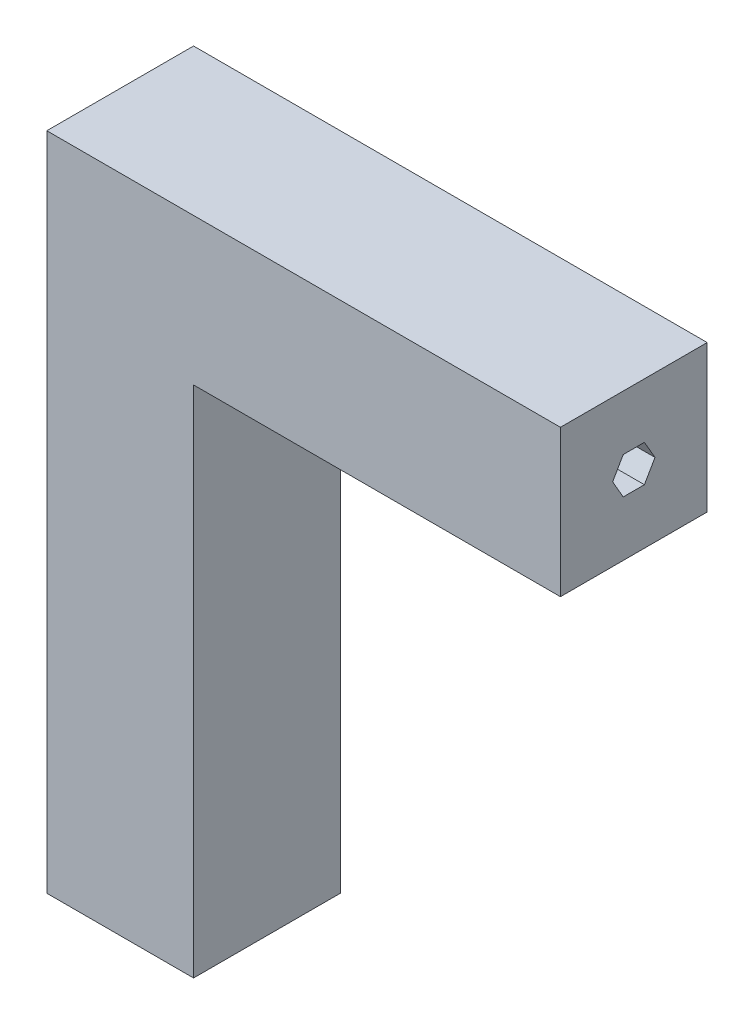
ISO-10303-21;
HEADER;
FILE_DESCRIPTION(('STEP AP214'),'2;1');
FILE_NAME('part.step','',(''),(''),'','','');
FILE_SCHEMA(('AUTOMOTIVE_DESIGN { 1 0 10303 214 1 1 1 1 }'));
ENDSEC;
DATA;
#1=APPLICATION_CONTEXT('core data for automotive mechanical design processes');
#2=APPLICATION_PROTOCOL_DEFINITION('international standard','automotive_design',2000,#1);
#3=PRODUCT_CONTEXT('',#1,'mechanical');
#4=PRODUCT('Part','Part','',(#3));
#5=PRODUCT_RELATED_PRODUCT_CATEGORY('part','',(#4));
#6=PRODUCT_DEFINITION_FORMATION('','',#4);
#7=PRODUCT_DEFINITION_CONTEXT('part definition',#1,'design');
#8=PRODUCT_DEFINITION('design','',#6,#7);
#9=PRODUCT_DEFINITION_SHAPE('','',#8);
#10=(LENGTH_UNIT() NAMED_UNIT(*) SI_UNIT(.MILLI.,.METRE.));
#11=(NAMED_UNIT(*) PLANE_ANGLE_UNIT() SI_UNIT($,.RADIAN.));
#12=(NAMED_UNIT(*) SI_UNIT($,.STERADIAN.) SOLID_ANGLE_UNIT());
#13=UNCERTAINTY_MEASURE_WITH_UNIT(LENGTH_MEASURE(1.E-05),#10,'distance_accuracy_value','');
#14=(GEOMETRIC_REPRESENTATION_CONTEXT(3) GLOBAL_UNCERTAINTY_ASSIGNED_CONTEXT((#13)) GLOBAL_UNIT_ASSIGNED_CONTEXT((#10,
#11,#12)) REPRESENTATION_CONTEXT('',''));
#15=CARTESIAN_POINT('',(0.,0.,0.));
#16=DIRECTION('',(0.,0.,1.));
#17=DIRECTION('',(1.,0.,0.));
#18=AXIS2_PLACEMENT_3D('',#15,#16,#17);
#19=CARTESIAN_POINT('',(0.,0.,-25.4));
#20=DIRECTION('',(-1.,0.,0.));
#21=DIRECTION('',(0.,0.,1.));
#22=AXIS2_PLACEMENT_3D('',#19,#20,#21);
#23=PLANE('',#22);
#24=DIRECTION('',(0.,-1.,0.));
#25=VECTOR('',#24,1.);
#26=CARTESIAN_POINT('',(0.,0.,25.4));
#27=LINE('',#26,#25);
#28=CARTESIAN_POINT('',(0.,228.6,25.4));
#29=VERTEX_POINT('',#28);
#30=CARTESIAN_POINT('',(0.,0.,25.4));
#31=VERTEX_POINT('',#30);
#32=EDGE_CURVE('E141',#29,#31,#27,.T.);
#33=ORIENTED_EDGE('',*,*,#32,.F.);
#34=DIRECTION('',(0.,0.,1.));
#35=VECTOR('',#34,1.);
#36=CARTESIAN_POINT('',(0.,228.6,-25.4));
#37=LINE('',#36,#35);
#38=CARTESIAN_POINT('',(0.,228.6,-25.4));
#39=VERTEX_POINT('',#38);
#40=EDGE_CURVE('E11',#39,#29,#37,.T.);
#41=ORIENTED_EDGE('',*,*,#40,.F.);
#42=DIRECTION('',(0.,-1.,0.));
#43=VECTOR('',#42,1.);
#44=CARTESIAN_POINT('',(0.,0.,-25.4));
#45=LINE('',#44,#43);
#46=CARTESIAN_POINT('',(0.,0.,-25.4));
#47=VERTEX_POINT('',#46);
#48=EDGE_CURVE('E162',#39,#47,#45,.T.);
#49=ORIENTED_EDGE('',*,*,#48,.T.);
#50=DIRECTION('',(0.,0.,1.));
#51=VECTOR('',#50,1.);
#52=CARTESIAN_POINT('',(0.,0.,-25.4));
#53=LINE('',#52,#51);
#54=EDGE_CURVE('E42',#47,#31,#53,.T.);
#55=ORIENTED_EDGE('',*,*,#54,.T.);
#56=EDGE_LOOP('',(#33,#41,#49,#55));
#57=FACE_BOUND('',#56,.T.);
#58=ADVANCED_FACE('F39',(#57),#23,.T.);
#59=CARTESIAN_POINT('',(0.,228.6,-25.4));
#60=DIRECTION('',(0.,1.,0.));
#61=DIRECTION('',(0.,0.,1.));
#62=AXIS2_PLACEMENT_3D('',#59,#60,#61);
#63=PLANE('',#62);
#64=DIRECTION('',(-1.,0.,0.));
#65=VECTOR('',#64,1.);
#66=CARTESIAN_POINT('',(0.,228.6,25.4));
#67=LINE('',#66,#65);
#68=CARTESIAN_POINT('',(177.8,228.6,25.4));
#69=VERTEX_POINT('',#68);
#70=EDGE_CURVE('E159',#69,#29,#67,.T.);
#71=ORIENTED_EDGE('',*,*,#70,.F.);
#72=DIRECTION('',(0.,0.,1.));
#73=VECTOR('',#72,1.);
#74=CARTESIAN_POINT('',(177.8,228.6,-25.4));
#75=LINE('',#74,#73);
#76=CARTESIAN_POINT('',(177.8,228.6,-25.4));
#77=VERTEX_POINT('',#76);
#78=EDGE_CURVE('E48',#77,#69,#75,.T.);
#79=ORIENTED_EDGE('',*,*,#78,.F.);
#80=DIRECTION('',(-1.,0.,0.));
#81=VECTOR('',#80,1.);
#82=CARTESIAN_POINT('',(50.8,228.6,-25.4));
#83=LINE('',#82,#81);
#84=EDGE_CURVE('E64',#77,#39,#83,.T.);
#85=ORIENTED_EDGE('',*,*,#84,.T.);
#86=ORIENTED_EDGE('',*,*,#40,.T.);
#87=EDGE_LOOP('',(#71,#79,#85,#86));
#88=FACE_BOUND('',#87,.T.);
#89=ADVANCED_FACE('F176',(#88),#63,.T.);
#90=CARTESIAN_POINT('',(177.8,228.6,-25.4));
#91=DIRECTION('',(1.,0.,0.));
#92=DIRECTION('',(0.,0.,-1.));
#93=AXIS2_PLACEMENT_3D('',#90,#91,#92);
#94=PLANE('',#93);
#95=DIRECTION('',(0.,0.866025403784439,-0.5));
#96=VECTOR('',#95,1.);
#97=CARTESIAN_POINT('',(177.8,196.85,-3.6661742093541));
#98=LINE('',#97,#96);
#99=CARTESIAN_POINT('',(177.8,196.85,-3.6661742093541));
#100=VERTEX_POINT('',#99);
#101=CARTESIAN_POINT('',(177.8,203.2,-7.33234841870826));
#102=VERTEX_POINT('',#101);
#103=EDGE_CURVE('E56',#100,#102,#98,.T.);
#104=ORIENTED_EDGE('',*,*,#103,.F.);
#105=DIRECTION('',(0.,0.,-1.));
#106=VECTOR('',#105,1.);
#107=CARTESIAN_POINT('',(177.8,196.85,3.66617420935411));
#108=LINE('',#107,#106);
#109=CARTESIAN_POINT('',(177.8,196.85,3.66617420935411));
#110=VERTEX_POINT('',#109);
#111=EDGE_CURVE('E244',#110,#100,#108,.T.);
#112=ORIENTED_EDGE('',*,*,#111,.F.);
#113=DIRECTION('',(0.,-0.866025403784438,-0.5));
#114=VECTOR('',#113,1.);
#115=CARTESIAN_POINT('',(177.8,203.2,7.33234841870825));
#116=LINE('',#115,#114);
#117=CARTESIAN_POINT('',(177.8,203.2,7.33234841870825));
#118=VERTEX_POINT('',#117);
#119=EDGE_CURVE('E251',#118,#110,#116,.T.);
#120=ORIENTED_EDGE('',*,*,#119,.F.);
#121=DIRECTION('',(0.,-0.866025403784439,0.5));
#122=VECTOR('',#121,1.);
#123=CARTESIAN_POINT('',(177.8,209.55,3.66617420935415));
#124=LINE('',#123,#122);
#125=CARTESIAN_POINT('',(177.8,209.55,3.66617420935415));
#126=VERTEX_POINT('',#125);
#127=EDGE_CURVE('E276',#126,#118,#124,.T.);
#128=ORIENTED_EDGE('',*,*,#127,.F.);
#129=DIRECTION('',(0.,0.,1.));
#130=VECTOR('',#129,1.);
#131=CARTESIAN_POINT('',(177.8,209.55,-3.66617420935417));
#132=LINE('',#131,#130);
#133=CARTESIAN_POINT('',(177.8,209.55,-3.66617420935417));
#134=VERTEX_POINT('',#133);
#135=EDGE_CURVE('E272',#134,#126,#132,.T.);
#136=ORIENTED_EDGE('',*,*,#135,.F.);
#137=DIRECTION('',(0.,0.866025403784439,0.5));
#138=VECTOR('',#137,1.);
#139=CARTESIAN_POINT('',(177.8,203.2,-7.33234841870825));
#140=LINE('',#139,#138);
#141=EDGE_CURVE('E268',#102,#134,#140,.T.);
#142=ORIENTED_EDGE('',*,*,#141,.F.);
#143=EDGE_LOOP('',(#104,#112,#120,#128,#136,#142));
#144=FACE_BOUND('',#143,.T.);
#145=DIRECTION('',(0.,1.,0.));
#146=VECTOR('',#145,1.);
#147=CARTESIAN_POINT('',(177.8,228.6,25.4));
#148=LINE('',#147,#146);
#149=CARTESIAN_POINT('',(177.8,177.8,25.4));
#150=VERTEX_POINT('',#149);
#151=EDGE_CURVE('E113',#150,#69,#148,.T.);
#152=ORIENTED_EDGE('',*,*,#151,.F.);
#153=DIRECTION('',(0.,0.,1.));
#154=VECTOR('',#153,1.);
#155=CARTESIAN_POINT('',(177.8,177.8,-25.4));
#156=LINE('',#155,#154);
#157=CARTESIAN_POINT('',(177.8,177.8,-25.4));
#158=VERTEX_POINT('',#157);
#159=EDGE_CURVE('E107',#158,#150,#156,.T.);
#160=ORIENTED_EDGE('',*,*,#159,.F.);
#161=DIRECTION('',(0.,1.,0.));
#162=VECTOR('',#161,1.);
#163=CARTESIAN_POINT('',(177.8,228.6,-25.4));
#164=LINE('',#163,#162);
#165=EDGE_CURVE('E111',#158,#77,#164,.T.);
#166=ORIENTED_EDGE('',*,*,#165,.T.);
#167=ORIENTED_EDGE('',*,*,#78,.T.);
#168=EDGE_LOOP('',(#152,#160,#166,#167));
#169=FACE_BOUND('',#168,.T.);
#170=ADVANCED_FACE('F109',(#144,#169),#94,.T.);
#171=CARTESIAN_POINT('',(50.8,177.8,-25.4));
#172=DIRECTION('',(0.,-1.,0.));
#173=DIRECTION('',(0.,0.,-1.));
#174=AXIS2_PLACEMENT_3D('',#171,#172,#173);
#175=PLANE('',#174);
#176=DIRECTION('',(1.,0.,0.));
#177=VECTOR('',#176,1.);
#178=CARTESIAN_POINT('',(50.8,177.8,25.4));
#179=LINE('',#178,#177);
#180=CARTESIAN_POINT('',(50.8,177.8,25.4));
#181=VERTEX_POINT('',#180);
#182=EDGE_CURVE('E154',#181,#150,#179,.T.);
#183=ORIENTED_EDGE('',*,*,#182,.F.);
#184=DIRECTION('',(0.,0.,1.));
#185=VECTOR('',#184,1.);
#186=CARTESIAN_POINT('',(50.8,177.8,-25.4));
#187=LINE('',#186,#185);
#188=CARTESIAN_POINT('',(50.8,177.8,-25.4));
#189=VERTEX_POINT('',#188);
#190=EDGE_CURVE('E119',#189,#181,#187,.T.);
#191=ORIENTED_EDGE('',*,*,#190,.F.);
#192=DIRECTION('',(1.,0.,0.));
#193=VECTOR('',#192,1.);
#194=CARTESIAN_POINT('',(50.8,177.8,-25.4));
#195=LINE('',#194,#193);
#196=EDGE_CURVE('E126',#189,#158,#195,.T.);
#197=ORIENTED_EDGE('',*,*,#196,.T.);
#198=ORIENTED_EDGE('',*,*,#159,.T.);
#199=EDGE_LOOP('',(#183,#191,#197,#198));
#200=FACE_BOUND('',#199,.T.);
#201=ADVANCED_FACE('F130',(#200),#175,.T.);
#202=CARTESIAN_POINT('',(50.8,0.,-25.4));
#203=DIRECTION('',(1.,0.,0.));
#204=DIRECTION('',(0.,1.,0.));
#205=AXIS2_PLACEMENT_3D('',#202,#203,#204);
#206=PLANE('',#205);
#207=DIRECTION('',(0.,1.,0.));
#208=VECTOR('',#207,1.);
#209=CARTESIAN_POINT('',(50.8,0.,25.4));
#210=LINE('',#209,#208);
#211=CARTESIAN_POINT('',(50.8,0.,25.4));
#212=VERTEX_POINT('',#211);
#213=EDGE_CURVE('E150',#212,#181,#210,.T.);
#214=ORIENTED_EDGE('',*,*,#213,.F.);
#215=DIRECTION('',(0.,0.,1.));
#216=VECTOR('',#215,1.);
#217=CARTESIAN_POINT('',(50.8,0.,-25.4));
#218=LINE('',#217,#216);
#219=CARTESIAN_POINT('',(50.8,0.,-25.4));
#220=VERTEX_POINT('',#219);
#221=EDGE_CURVE('E167',#220,#212,#218,.T.);
#222=ORIENTED_EDGE('',*,*,#221,.F.);
#223=DIRECTION('',(0.,1.,0.));
#224=VECTOR('',#223,1.);
#225=CARTESIAN_POINT('',(50.8,0.,-25.4));
#226=LINE('',#225,#224);
#227=EDGE_CURVE('E132',#220,#189,#226,.T.);
#228=ORIENTED_EDGE('',*,*,#227,.T.);
#229=ORIENTED_EDGE('',*,*,#190,.T.);
#230=EDGE_LOOP('',(#214,#222,#228,#229));
#231=FACE_BOUND('',#230,.T.);
#232=ADVANCED_FACE('F190',(#231),#206,.T.);
#233=CARTESIAN_POINT('',(0.,0.,-25.4));
#234=DIRECTION('',(0.,-1.,0.));
#235=DIRECTION('',(0.,0.,-1.));
#236=AXIS2_PLACEMENT_3D('',#233,#234,#235);
#237=PLANE('',#236);
#238=DIRECTION('',(1.,0.,0.));
#239=VECTOR('',#238,1.);
#240=CARTESIAN_POINT('',(0.,0.,25.4));
#241=LINE('',#240,#239);
#242=EDGE_CURVE('E145',#31,#212,#241,.T.);
#243=ORIENTED_EDGE('',*,*,#242,.F.);
#244=ORIENTED_EDGE('',*,*,#54,.F.);
#245=DIRECTION('',(1.,0.,0.));
#246=VECTOR('',#245,1.);
#247=CARTESIAN_POINT('',(0.,0.,-25.4));
#248=LINE('',#247,#246);
#249=EDGE_CURVE('E135',#47,#220,#248,.T.);
#250=ORIENTED_EDGE('',*,*,#249,.T.);
#251=ORIENTED_EDGE('',*,*,#221,.T.);
#252=EDGE_LOOP('',(#243,#244,#250,#251));
#253=FACE_BOUND('',#252,.T.);
#254=ADVANCED_FACE('F173',(#253),#237,.T.);
#255=CARTESIAN_POINT('',(0.,0.,-25.4));
#256=DIRECTION('',(0.,0.,-1.));
#257=DIRECTION('',(-1.,0.,0.));
#258=AXIS2_PLACEMENT_3D('',#255,#256,#257);
#259=PLANE('',#258);
#260=ORIENTED_EDGE('',*,*,#48,.F.);
#261=ORIENTED_EDGE('',*,*,#84,.F.);
#262=ORIENTED_EDGE('',*,*,#165,.F.);
#263=ORIENTED_EDGE('',*,*,#196,.F.);
#264=ORIENTED_EDGE('',*,*,#227,.F.);
#265=ORIENTED_EDGE('',*,*,#249,.F.);
#266=EDGE_LOOP('',(#260,#261,#262,#263,#264,#265));
#267=FACE_BOUND('',#266,.T.);
#268=ADVANCED_FACE('F124',(#267),#259,.T.);
#269=CARTESIAN_POINT('',(0.,0.,25.4));
#270=DIRECTION('',(0.,0.,-1.));
#271=DIRECTION('',(-1.,0.,0.));
#272=AXIS2_PLACEMENT_3D('',#269,#270,#271);
#273=PLANE('',#272);
#274=ORIENTED_EDGE('',*,*,#32,.T.);
#275=ORIENTED_EDGE('',*,*,#242,.T.);
#276=ORIENTED_EDGE('',*,*,#213,.T.);
#277=ORIENTED_EDGE('',*,*,#182,.T.);
#278=ORIENTED_EDGE('',*,*,#151,.T.);
#279=ORIENTED_EDGE('',*,*,#70,.T.);
#280=EDGE_LOOP('',(#274,#275,#276,#277,#278,#279));
#281=FACE_BOUND('',#280,.T.);
#282=ADVANCED_FACE('F175',(#281),#273,.F.);
#283=CARTESIAN_POINT('',(101.6,196.85,-3.6661742093541));
#284=DIRECTION('',(0.,-0.5,-0.866025403784439));
#285=DIRECTION('',(0.,0.866025403784439,-0.5));
#286=AXIS2_PLACEMENT_3D('',#283,#284,#285);
#287=PLANE('',#286);
#288=ORIENTED_EDGE('',*,*,#103,.T.);
#289=DIRECTION('',(1.,0.,0.));
#290=VECTOR('',#289,1.);
#291=CARTESIAN_POINT('',(101.6,203.2,-7.33234841870825));
#292=LINE('',#291,#290);
#293=CARTESIAN_POINT('',(101.6,203.2,-7.33234841870825));
#294=VERTEX_POINT('',#293);
#295=EDGE_CURVE('E265',#294,#102,#292,.T.);
#296=ORIENTED_EDGE('',*,*,#295,.F.);
#297=DIRECTION('',(0.,0.866025403784439,-0.5));
#298=VECTOR('',#297,1.);
#299=CARTESIAN_POINT('',(101.6,196.85,-3.6661742093541));
#300=LINE('',#299,#298);
#301=CARTESIAN_POINT('',(101.6,196.85,-3.6661742093541));
#302=VERTEX_POINT('',#301);
#303=EDGE_CURVE('E234',#302,#294,#300,.T.);
#304=ORIENTED_EDGE('',*,*,#303,.F.);
#305=DIRECTION('',(1.,0.,0.));
#306=VECTOR('',#305,1.);
#307=CARTESIAN_POINT('',(101.6,196.85,-3.6661742093541));
#308=LINE('',#307,#306);
#309=EDGE_CURVE('E146',#302,#100,#308,.T.);
#310=ORIENTED_EDGE('',*,*,#309,.T.);
#311=EDGE_LOOP('',(#288,#296,#304,#310));
#312=FACE_BOUND('',#311,.T.);
#313=ADVANCED_FACE('F200',(#312),#287,.F.);
#314=CARTESIAN_POINT('',(101.6,196.85,3.66617420935411));
#315=DIRECTION('',(0.,-1.,0.));
#316=DIRECTION('',(0.,0.,-1.));
#317=AXIS2_PLACEMENT_3D('',#314,#315,#316);
#318=PLANE('',#317);
#319=ORIENTED_EDGE('',*,*,#111,.T.);
#320=ORIENTED_EDGE('',*,*,#309,.F.);
#321=DIRECTION('',(0.,0.,-1.));
#322=VECTOR('',#321,1.);
#323=CARTESIAN_POINT('',(101.6,196.85,3.66617420935411));
#324=LINE('',#323,#322);
#325=CARTESIAN_POINT('',(101.6,196.85,3.66617420935411));
#326=VERTEX_POINT('',#325);
#327=EDGE_CURVE('E241',#326,#302,#324,.T.);
#328=ORIENTED_EDGE('',*,*,#327,.F.);
#329=DIRECTION('',(1.,0.,0.));
#330=VECTOR('',#329,1.);
#331=CARTESIAN_POINT('',(101.6,196.85,3.66617420935411));
#332=LINE('',#331,#330);
#333=EDGE_CURVE('E285',#326,#110,#332,.T.);
#334=ORIENTED_EDGE('',*,*,#333,.T.);
#335=EDGE_LOOP('',(#319,#320,#328,#334));
#336=FACE_BOUND('',#335,.T.);
#337=ADVANCED_FACE('F204',(#336),#318,.F.);
#338=CARTESIAN_POINT('',(101.6,203.2,7.33234841870825));
#339=DIRECTION('',(0.,-0.500000000000001,0.866025403784438));
#340=DIRECTION('',(0.,-0.866025403784438,-0.500000000000001));
#341=AXIS2_PLACEMENT_3D('',#338,#339,#340);
#342=PLANE('',#341);
#343=ORIENTED_EDGE('',*,*,#119,.T.);
#344=ORIENTED_EDGE('',*,*,#333,.F.);
#345=DIRECTION('',(0.,-0.866025403784438,-0.5));
#346=VECTOR('',#345,1.);
#347=CARTESIAN_POINT('',(101.6,203.2,7.33234841870825));
#348=LINE('',#347,#346);
#349=CARTESIAN_POINT('',(101.6,203.2,7.33234841870825));
#350=VERTEX_POINT('',#349);
#351=EDGE_CURVE('E260',#350,#326,#348,.T.);
#352=ORIENTED_EDGE('',*,*,#351,.F.);
#353=DIRECTION('',(1.,0.,0.));
#354=VECTOR('',#353,1.);
#355=CARTESIAN_POINT('',(101.6,203.2,7.33234841870825));
#356=LINE('',#355,#354);
#357=EDGE_CURVE('E289',#350,#118,#356,.T.);
#358=ORIENTED_EDGE('',*,*,#357,.T.);
#359=EDGE_LOOP('',(#343,#344,#352,#358));
#360=FACE_BOUND('',#359,.T.);
#361=ADVANCED_FACE('F217',(#360),#342,.F.);
#362=CARTESIAN_POINT('',(101.6,209.55,3.66617420935415));
#363=DIRECTION('',(0.,0.5,0.866025403784439));
#364=DIRECTION('',(0.,-0.866025403784439,0.5));
#365=AXIS2_PLACEMENT_3D('',#362,#363,#364);
#366=PLANE('',#365);
#367=ORIENTED_EDGE('',*,*,#127,.T.);
#368=ORIENTED_EDGE('',*,*,#357,.F.);
#369=DIRECTION('',(0.,-0.866025403784439,0.5));
#370=VECTOR('',#369,1.);
#371=CARTESIAN_POINT('',(101.6,209.55,3.66617420935415));
#372=LINE('',#371,#370);
#373=CARTESIAN_POINT('',(101.6,209.55,3.66617420935415));
#374=VERTEX_POINT('',#373);
#375=EDGE_CURVE('E256',#374,#350,#372,.T.);
#376=ORIENTED_EDGE('',*,*,#375,.F.);
#377=DIRECTION('',(1.,0.,0.));
#378=VECTOR('',#377,1.);
#379=CARTESIAN_POINT('',(101.6,209.55,3.66617420935415));
#380=LINE('',#379,#378);
#381=EDGE_CURVE('E293',#374,#126,#380,.T.);
#382=ORIENTED_EDGE('',*,*,#381,.T.);
#383=EDGE_LOOP('',(#367,#368,#376,#382));
#384=FACE_BOUND('',#383,.T.);
#385=ADVANCED_FACE('F213',(#384),#366,.F.);
#386=CARTESIAN_POINT('',(101.6,209.55,-3.66617420935417));
#387=DIRECTION('',(0.,1.,0.));
#388=DIRECTION('',(0.,0.,1.));
#389=AXIS2_PLACEMENT_3D('',#386,#387,#388);
#390=PLANE('',#389);
#391=ORIENTED_EDGE('',*,*,#135,.T.);
#392=ORIENTED_EDGE('',*,*,#381,.F.);
#393=DIRECTION('',(0.,0.,1.));
#394=VECTOR('',#393,1.);
#395=CARTESIAN_POINT('',(101.6,209.55,-3.66617420935417));
#396=LINE('',#395,#394);
#397=CARTESIAN_POINT('',(101.6,209.55,-3.66617420935417));
#398=VERTEX_POINT('',#397);
#399=EDGE_CURVE('E248',#398,#374,#396,.T.);
#400=ORIENTED_EDGE('',*,*,#399,.F.);
#401=DIRECTION('',(1.,0.,0.));
#402=VECTOR('',#401,1.);
#403=CARTESIAN_POINT('',(101.6,209.55,-3.66617420935417));
#404=LINE('',#403,#402);
#405=EDGE_CURVE('E297',#398,#134,#404,.T.);
#406=ORIENTED_EDGE('',*,*,#405,.T.);
#407=EDGE_LOOP('',(#391,#392,#400,#406));
#408=FACE_BOUND('',#407,.T.);
#409=ADVANCED_FACE('F209',(#408),#390,.F.);
#410=CARTESIAN_POINT('',(101.6,203.2,-7.33234841870825));
#411=DIRECTION('',(0.,0.5,-0.866025403784439));
#412=DIRECTION('',(0.,0.866025403784439,0.5));
#413=AXIS2_PLACEMENT_3D('',#410,#411,#412);
#414=PLANE('',#413);
#415=ORIENTED_EDGE('',*,*,#141,.T.);
#416=ORIENTED_EDGE('',*,*,#405,.F.);
#417=DIRECTION('',(0.,0.866025403784439,0.5));
#418=VECTOR('',#417,1.);
#419=CARTESIAN_POINT('',(101.6,203.2,-7.33234841870825));
#420=LINE('',#419,#418);
#421=EDGE_CURVE('E238',#294,#398,#420,.T.);
#422=ORIENTED_EDGE('',*,*,#421,.F.);
#423=ORIENTED_EDGE('',*,*,#295,.T.);
#424=EDGE_LOOP('',(#415,#416,#422,#423));
#425=FACE_BOUND('',#424,.T.);
#426=ADVANCED_FACE('F205',(#425),#414,.F.);
#427=CARTESIAN_POINT('',(101.6,0.,0.));
#428=DIRECTION('',(1.,0.,0.));
#429=DIRECTION('',(0.,0.,-1.));
#430=AXIS2_PLACEMENT_3D('',#427,#428,#429);
#431=PLANE('',#430);
#432=ORIENTED_EDGE('',*,*,#303,.T.);
#433=ORIENTED_EDGE('',*,*,#421,.T.);
#434=ORIENTED_EDGE('',*,*,#399,.T.);
#435=ORIENTED_EDGE('',*,*,#375,.T.);
#436=ORIENTED_EDGE('',*,*,#351,.T.);
#437=ORIENTED_EDGE('',*,*,#327,.T.);
#438=EDGE_LOOP('',(#432,#433,#434,#435,#436,#437));
#439=FACE_BOUND('',#438,.T.);
#440=ADVANCED_FACE('F208',(#439),#431,.T.);
#441=CLOSED_SHELL('',(#58,#89,#170,#201,#232,#254,#268,#282,#313,#337,#361,#385,#409,#426,#440));
#442=MANIFOLD_SOLID_BREP('B2',#441);
#443=ADVANCED_BREP_SHAPE_REPRESENTATION('',(#18,#442),#14);
#444=SHAPE_DEFINITION_REPRESENTATION(#9,#443);
ENDSEC;
END-ISO-10303-21;
